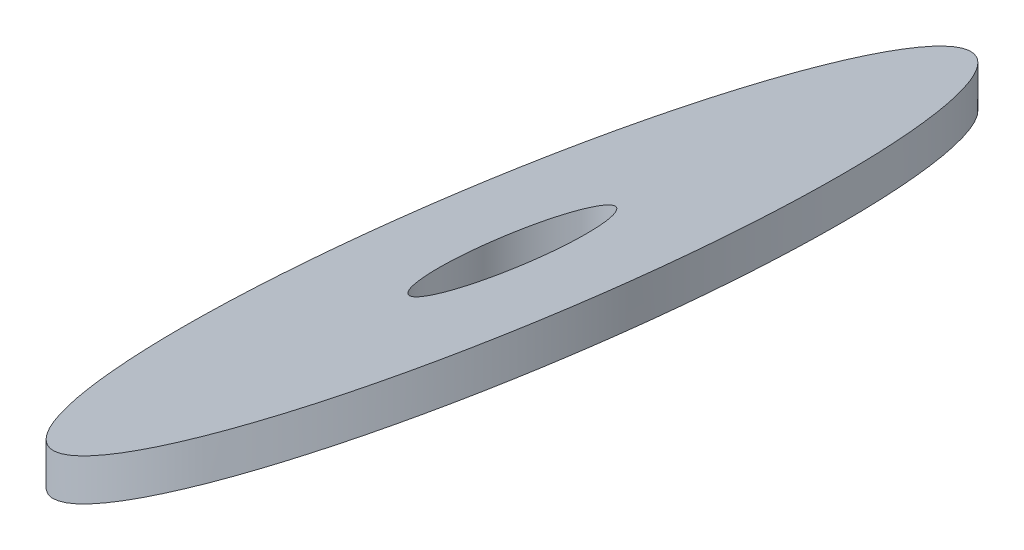
ISO-10303-21;
HEADER;
FILE_DESCRIPTION(('STEP AP214'),'2;1');
FILE_NAME('part.step','',(''),(''),'','','');
FILE_SCHEMA(('AUTOMOTIVE_DESIGN { 1 0 10303 214 1 1 1 1 }'));
ENDSEC;
DATA;
#1=APPLICATION_CONTEXT('core data for automotive mechanical design processes');
#2=APPLICATION_PROTOCOL_DEFINITION('international standard','automotive_design',2000,#1);
#3=PRODUCT_CONTEXT('',#1,'mechanical');
#4=PRODUCT('Part','Part','',(#3));
#5=PRODUCT_RELATED_PRODUCT_CATEGORY('part','',(#4));
#6=PRODUCT_DEFINITION_FORMATION('','',#4);
#7=PRODUCT_DEFINITION_CONTEXT('part definition',#1,'design');
#8=PRODUCT_DEFINITION('design','',#6,#7);
#9=PRODUCT_DEFINITION_SHAPE('','',#8);
#10=(LENGTH_UNIT() NAMED_UNIT(*) SI_UNIT(.MILLI.,.METRE.));
#11=(NAMED_UNIT(*) PLANE_ANGLE_UNIT() SI_UNIT($,.RADIAN.));
#12=(NAMED_UNIT(*) SI_UNIT($,.STERADIAN.) SOLID_ANGLE_UNIT());
#13=UNCERTAINTY_MEASURE_WITH_UNIT(LENGTH_MEASURE(1.E-05),#10,'distance_accuracy_value','');
#14=(GEOMETRIC_REPRESENTATION_CONTEXT(3) GLOBAL_UNCERTAINTY_ASSIGNED_CONTEXT((#13)) GLOBAL_UNIT_ASSIGNED_CONTEXT((#10,
#11,#12)) REPRESENTATION_CONTEXT('',''));
#15=CARTESIAN_POINT('',(0.,0.,0.));
#16=DIRECTION('',(0.,0.,1.));
#17=DIRECTION('',(1.,0.,0.));
#18=AXIS2_PLACEMENT_3D('',#15,#16,#17);
#19=CARTESIAN_POINT('',(24.834212463734,148.471380654833,0.));
#20=DIRECTION('',(0.,-1.,0.));
#21=DIRECTION('',(0.,0.,-1.));
#22=AXIS2_PLACEMENT_3D('',#19,#20,#21);
#23=CYLINDRICAL_SURFACE('',#22,28.966767553693);
#24=CARTESIAN_POINT('',(24.834212463734,70.9959205911231,0.));
#25=DIRECTION('',(-0.573629133636462,0.819115142726273,0.));
#26=DIRECTION('',(-0.819115142726273,-0.573629133636462,0.));
#27=AXIS2_PLACEMENT_3D('',#24,#25,#26);
#28=ELLIPSE('',#27,35.3634868197925,28.966767553693);
#29=CARTESIAN_POINT('',(-4.13255508995896,50.710394284321,0.));
#30=VERTEX_POINT('',#29);
#31=EDGE_CURVE('E103',#30,#30,#28,.F.);
#32=ORIENTED_EDGE('',*,*,#31,.F.);
#33=EDGE_LOOP('',(#32));
#34=FACE_BOUND('',#33,.T.);
#35=CARTESIAN_POINT('',(24.834212463734,74.6582993539369,0.));
#36=DIRECTION('',(0.573629133636462,-0.819115142726273,0.));
#37=DIRECTION('',(-0.819115142726273,-0.573629133636462,0.));
#38=AXIS2_PLACEMENT_3D('',#35,#36,#37);
#39=ELLIPSE('',#38,35.3634868197925,28.966767553693);
#40=CARTESIAN_POINT('',(-4.13255508995895,54.3727730471349,0.));
#41=VERTEX_POINT('',#40);
#42=EDGE_CURVE('E107',#41,#41,#39,.F.);
#43=ORIENTED_EDGE('',*,*,#42,.F.);
#44=EDGE_LOOP('',(#43));
#45=FACE_BOUND('',#44,.T.);
#46=ADVANCED_FACE('F63',(#34,#45),#23,.T.);
#47=CARTESIAN_POINT('',(-26.9078617986992,38.4231479283068,-108.758603935145));
#48=DIRECTION('',(0.573629133636462,-0.819115142726273,0.));
#49=DIRECTION('',(0.819115142726273,0.573629133636462,0.));
#50=AXIS2_PLACEMENT_3D('',#47,#48,#49);
#51=PLANE('',#50);
#52=CARTESIAN_POINT('',(24.8641144943987,74.6792398481964,0.));
#53=DIRECTION('',(0.573629133636462,-0.819115142726273,0.));
#54=DIRECTION('',(-0.819115142726273,-0.573629133636462,0.));
#55=AXIS2_PLACEMENT_3D('',#52,#53,#54);
#56=ELLIPSE('',#55,7.93539230439076,6.5);
#57=CARTESIAN_POINT('',(18.3641144943987,70.1272676355633,0.));
#58=VERTEX_POINT('',#57);
#59=EDGE_CURVE('E110',#58,#58,#56,.F.);
#60=ORIENTED_EDGE('',*,*,#59,.F.);
#61=EDGE_LOOP('',(#60));
#62=FACE_BOUND('',#61,.T.);
#63=ORIENTED_EDGE('',*,*,#42,.T.);
#64=EDGE_LOOP('',(#63));
#65=FACE_BOUND('',#64,.T.);
#66=ADVANCED_FACE('F128',(#62,#65),#51,.F.);
#67=CARTESIAN_POINT('',(24.8641144943987,93.9832591594294,0.));
#68=DIRECTION('',(0.,-1.,0.));
#69=DIRECTION('',(0.,0.,-1.));
#70=AXIS2_PLACEMENT_3D('',#67,#68,#69);
#71=CYLINDRICAL_SURFACE('',#70,6.5);
#72=ORIENTED_EDGE('',*,*,#59,.T.);
#73=EDGE_LOOP('',(#72));
#74=FACE_BOUND('',#73,.T.);
#75=CARTESIAN_POINT('',(24.8641144943987,71.505192919499,0.));
#76=DIRECTION('',(0.573629133636462,-0.819115142726273,0.));
#77=DIRECTION('',(-0.819115142726273,-0.573629133636462,0.));
#78=AXIS2_PLACEMENT_3D('',#75,#76,#77);
#79=ELLIPSE('',#78,7.93539230439076,6.5);
#80=CARTESIAN_POINT('',(18.3641144943987,66.9532207068659,0.));
#81=VERTEX_POINT('',#80);
#82=EDGE_CURVE('E81',#81,#81,#79,.T.);
#83=ORIENTED_EDGE('',*,*,#82,.T.);
#84=EDGE_LOOP('',(#83));
#85=FACE_BOUND('',#84,.T.);
#86=ADVANCED_FACE('F65',(#74,#85),#71,.F.);
#87=CARTESIAN_POINT('',(-25.1870260800424,35.9658762999288,-108.758603935145));
#88=DIRECTION('',(-0.573629133636462,0.819115142726273,0.));
#89=DIRECTION('',(-0.819115142726273,-0.573629133636462,0.));
#90=AXIS2_PLACEMENT_3D('',#87,#88,#89);
#91=PLANE('',#90);
#92=CARTESIAN_POINT('',(34.6474213236797,77.8681442906981,0.));
#93=CARTESIAN_POINT('',(34.6474195356364,77.8681430385252,0.216417099883693));
#94=CARTESIAN_POINT('',(34.6396036920059,77.8626695765215,0.432895981068456));
#95=CARTESIAN_POINT('',(34.6084535535457,77.8408550281076,0.864275765630977));
#96=CARTESIAN_POINT('',(34.5851099832784,77.8245074460767,1.07917564817762));
#97=CARTESIAN_POINT('',(34.5232037443125,77.781154295375,1.50614265602207));
#98=CARTESIAN_POINT('',(34.4846096246183,77.7541267014644,1.71820298499667));
#99=CARTESIAN_POINT('',(34.3927875847711,77.6898234131734,2.13755304907121));
#100=CARTESIAN_POINT('',(34.3395583429507,77.6525467932248,2.34484235147658));
#101=CARTESIAN_POINT('',(34.2195249132046,77.56848697218,2.75231440507734));
#102=CARTESIAN_POINT('',(34.1527885265331,77.5217512525337,2.9525270035119));
#103=CARTESIAN_POINT('',(34.0064515569986,77.4192709726873,3.34580730184386));
#104=CARTESIAN_POINT('',(33.9268505899111,77.3635261434132,3.53887478812748));
#105=CARTESIAN_POINT('',(33.75577483122,77.2437212049799,3.9168550846324));
#106=CARTESIAN_POINT('',(33.6643061985568,77.1796654089475,4.10177205848218));
#107=CARTESIAN_POINT('',(33.4704079773391,77.0438778220149,4.46290108250622));
#108=CARTESIAN_POINT('',(33.3679744937236,76.9721433033901,4.63911000659928));
#109=CARTESIAN_POINT('',(33.1433864544019,76.8148635319621,4.99778923063245));
#110=CARTESIAN_POINT('',(33.0202858356277,76.7286557479593,5.17937718128756));
#111=CARTESIAN_POINT('',(32.7634336232226,76.5487812658637,5.53099591127756));
#112=CARTESIAN_POINT('',(32.6296781896177,76.455111878624,5.70102248261941));
#113=CARTESIAN_POINT('',(32.2141680313284,76.1641286948394,6.19320678018305));
#114=CARTESIAN_POINT('',(31.9181020820982,75.956792698839,6.49757503186352));
#115=CARTESIAN_POINT('',(31.238931847154,75.48116746236,7.10898249221294));
#116=CARTESIAN_POINT('',(30.8498640137125,75.2087019290285,7.40607111315812));
#117=CARTESIAN_POINT('',(30.0417421077059,74.6427713966343,7.93147799701541));
#118=CARTESIAN_POINT('',(29.622668379863,74.3492926329135,8.15975066267161));
#119=CARTESIAN_POINT('',(28.679460173108,73.688760702471,8.58662799792833));
#120=CARTESIAN_POINT('',(28.1508737396167,73.3185898167437,8.77056657902733));
#121=CARTESIAN_POINT('',(27.0772180376636,72.5667050596321,9.04296190342725));
#122=CARTESIAN_POINT('',(26.5321392872789,72.1849845480247,9.13136260408299));
#123=CARTESIAN_POINT('',(25.6712086596295,71.5820718873994,9.19603986491297));
#124=CARTESIAN_POINT('',(25.3567224083763,71.361836090944,9.20405394252993));
#125=CARTESIAN_POINT('',(24.7281215787228,70.9216247818023,9.18901633096266));
#126=CARTESIAN_POINT('',(24.4140070916258,70.701649333056,9.16595815568945));
#127=CARTESIAN_POINT('',(23.7880491087389,70.2632888185365,9.08862595204382));
#128=CARTESIAN_POINT('',(23.4762082552843,70.0449056031997,9.03432011691743));
#129=CARTESIAN_POINT('',(22.8573030490368,69.6114841722623,8.89426765841602));
#130=CARTESIAN_POINT('',(22.5502383746579,69.3964457314541,8.80852316148015));
#131=CARTESIAN_POINT('',(21.9338478486862,68.9647853397074,8.60215285177042));
#132=CARTESIAN_POINT('',(21.624744098168,68.7483189269105,8.48053323313328));
#133=CARTESIAN_POINT('',(21.0168902568043,68.3226368045675,8.2031422110613));
#134=CARTESIAN_POINT('',(20.7181418679203,68.1134222869107,8.047365224206));
#135=CARTESIAN_POINT('',(20.1348815301774,67.7049630791974,7.70164412755453));
#136=CARTESIAN_POINT('',(19.8503432758924,67.505699967361,7.51176638619158));
#137=CARTESIAN_POINT('',(19.2987211707974,67.1193971220892,7.09747138905283));
#138=CARTESIAN_POINT('',(19.0316281658359,66.9323509779702,6.87307245862085));
#139=CARTESIAN_POINT('',(18.6037735950607,66.6327229599369,6.46966817519111));
#140=CARTESIAN_POINT('',(18.4369989473022,66.5159301041878,6.30010509970539));
#141=CARTESIAN_POINT('',(18.1146930183629,66.2902181607265,5.94576875710982));
#142=CARTESIAN_POINT('',(17.9591587166426,66.18129695772,5.76099960498132));
#143=CARTESIAN_POINT('',(17.6609409603188,65.9724540438586,5.37665813987634));
#144=CARTESIAN_POINT('',(17.5182542656375,65.872530063966,5.17708958249092));
#145=CARTESIAN_POINT('',(17.2473886119782,65.6828419210715,4.76372470787601));
#146=CARTESIAN_POINT('',(17.1192102729871,65.5930781922486,4.5499277832439));
#147=CARTESIAN_POINT('',(16.8780484051236,65.4241917120546,4.10702231005065));
#148=CARTESIAN_POINT('',(16.7652160494757,65.3451748278092,3.8777906457877));
#149=CARTESIAN_POINT('',(16.5580058567745,65.2000648217553,3.40716711069992));
#150=CARTESIAN_POINT('',(16.4636283499485,65.1339719312062,3.16577502237608));
#151=CARTESIAN_POINT('',(16.2951725140945,65.0160017336887,2.67288693413868));
#152=CARTESIAN_POINT('',(16.2210752846012,64.96411119066,2.42140059411366));
#153=CARTESIAN_POINT('',(16.094621001762,64.8755548242519,1.9104150973175));
#154=CARTESIAN_POINT('',(16.042259522443,64.8388859013485,1.65091758340673));
#155=CARTESIAN_POINT('',(15.9665243192268,64.7858482797241,1.16557702799892));
#156=CARTESIAN_POINT('',(15.940000118332,64.7672732911956,0.940460365069117));
#157=CARTESIAN_POINT('',(15.9040094694685,64.7420689168046,0.488211160852438));
#158=CARTESIAN_POINT('',(15.8945410980366,64.7354381839344,0.261078849782937));
#159=CARTESIAN_POINT('',(15.8928296697495,64.7342396648563,-0.193191353166451));
#160=CARTESIAN_POINT('',(15.9005800307559,64.7396672691546,-0.420329209734519));
#161=CARTESIAN_POINT('',(15.9331543036704,64.7624791437937,-0.872767475316105));
#162=CARTESIAN_POINT('',(15.9579777573344,64.7798630932245,-1.09806793348144));
#163=CARTESIAN_POINT('',(16.0215034825952,64.8243503757129,-1.52638786930362));
#164=CARTESIAN_POINT('',(16.0588807890977,64.8505258311871,-1.72970287887979));
#165=CARTESIAN_POINT('',(16.1471094118867,64.9123126372324,-2.13199441534885));
#166=CARTESIAN_POINT('',(16.197965201125,64.9479271202269,-2.33096947822442));
#167=CARTESIAN_POINT('',(16.3124637554463,65.0281108490972,-2.72330138102948));
#168=CARTESIAN_POINT('',(16.3761040538722,65.0726783675647,-2.91665929651276));
#169=CARTESIAN_POINT('',(16.5154056088404,65.170231722548,-3.29681505929502));
#170=CARTESIAN_POINT('',(16.5910681542895,65.2232184616898,-3.48361220058758));
#171=CARTESIAN_POINT('',(16.7582632335535,65.3403057470588,-3.86037125936873));
#172=CARTESIAN_POINT('',(16.8504593543281,65.4048710055016,-4.04989442024594));
#173=CARTESIAN_POINT('',(17.0463040508757,65.5420217157595,-4.41985617467965));
#174=CARTESIAN_POINT('',(17.1499532260844,65.6146075873614,-4.60029429201847));
#175=CARTESIAN_POINT('',(17.4765962268683,65.8433567970567,-5.12714341818351));
#176=CARTESIAN_POINT('',(17.7153359582097,66.0105470467671,-5.45920097041931));
#177=CARTESIAN_POINT('',(18.2660534440492,66.3962163840829,-6.12951687529985));
#178=CARTESIAN_POINT('',(18.5836478394626,66.6186288245152,-6.46083712450543));
#179=CARTESIAN_POINT('',(19.2533902139697,67.087651698112,-7.06642912404254));
#180=CARTESIAN_POINT('',(19.6055594371364,67.3342770085734,-7.34066547293175));
#181=CARTESIAN_POINT('',(20.4076021865577,67.8959502868365,-7.88041617628144));
#182=CARTESIAN_POINT('',(20.8630555665,68.2149058452437,-8.13356787041656));
#183=CARTESIAN_POINT('',(21.7985218874793,68.8700161066209,-8.55919458788437));
#184=CARTESIAN_POINT('',(22.2785494881374,69.2061810757736,-8.73162081780263));
#185=CARTESIAN_POINT('',(23.3416126550423,69.9506478443928,-9.02123134428155));
#186=CARTESIAN_POINT('',(23.9275300516316,70.3609677994964,-9.12270759018395));
#187=CARTESIAN_POINT('',(25.1058171258121,71.1861262641386,-9.21614644703169));
#188=CARTESIAN_POINT('',(25.6981923079476,71.6009686285285,-9.20800690393516));
#189=CARTESIAN_POINT('',(26.6097889571614,72.2393628771978,-9.11037411292779));
#190=CARTESIAN_POINT('',(26.9320418906431,72.465037707759,-9.05911499003725));
#191=CARTESIAN_POINT('',(27.5719161126264,72.9131438120742,-8.92313764649814));
#192=CARTESIAN_POINT('',(27.8895366989386,73.1355745940824,-8.83841440677993));
#193=CARTESIAN_POINT('',(28.5172652578203,73.5751750490218,-8.63525780052491));
#194=CARTESIAN_POINT('',(28.8273774870416,73.7923477029007,-8.51684404362483));
#195=CARTESIAN_POINT('',(29.4374218345083,74.2195638441534,-8.24591185688428));
#196=CARTESIAN_POINT('',(29.7373567947827,74.4296093218097,-8.09340303997161));
#197=CARTESIAN_POINT('',(30.2564840005464,74.793155878034,-7.79291934065483));
#198=CARTESIAN_POINT('',(30.4784059815527,74.948568599713,-7.65194012570629));
#199=CARTESIAN_POINT('',(30.9126533827472,75.2526735387353,-7.34940319901141));
#200=CARTESIAN_POINT('',(31.1249795562854,75.4013662836524,-7.18784710653568));
#201=CARTESIAN_POINT('',(31.5379062699518,75.6905402723391,-6.84435013714735));
#202=CARTESIAN_POINT('',(31.7385209673764,75.8310314305118,-6.66243468182391));
#203=CARTESIAN_POINT('',(32.1262035675951,76.1025268802836,-6.27821191941811));
#204=CARTESIAN_POINT('',(32.3132737573492,76.2335327734486,-6.07590806873387));
#205=CARTESIAN_POINT('',(32.6390699890677,76.4616889878737,-5.68981917172769));
#206=CARTESIAN_POINT('',(32.7804138591679,76.5606725831233,-5.50932077500129));
#207=CARTESIAN_POINT('',(33.0510742083431,76.7502169505859,-5.13535775319636));
#208=CARTESIAN_POINT('',(33.1803926835207,76.8407791206764,-4.94189528923717));
#209=CARTESIAN_POINT('',(33.4256187723792,77.0125117887221,-4.5425092385892));
#210=CARTESIAN_POINT('',(33.5415196027098,77.0936775362738,-4.3365794284028));
#211=CARTESIAN_POINT('',(33.7583243106162,77.2455066141135,-3.91324532437582));
#212=CARTESIAN_POINT('',(33.8592285596276,77.3161702045191,-3.69584131490926));
#213=CARTESIAN_POINT('',(34.0453768304935,77.4465304747362,-3.24876691207908));
#214=CARTESIAN_POINT('',(34.1304721658411,77.5061230288788,-3.01900393608659));
#215=CARTESIAN_POINT('',(34.282410656881,77.6125260733777,-2.55066337326307));
#216=CARTESIAN_POINT('',(34.3492568525362,77.6593386926304,-2.31208726206089));
#217=CARTESIAN_POINT('',(34.4632907273433,77.739197004849,-1.82877377036877));
#218=CARTESIAN_POINT('',(34.510534824785,77.7722822077361,-1.58405625254057));
#219=CARTESIAN_POINT('',(34.5846545634843,77.8241885140386,-1.09020423125694));
#220=CARTESIAN_POINT('',(34.6115473848038,77.8430216487103,-0.841073635472119));
#221=CARTESIAN_POINT('',(34.6344689147368,77.8590736744528,-0.492721690111019));
#222=CARTESIAN_POINT('',(34.6393237595048,77.8624735388344,-0.39427568246718));
#223=CARTESIAN_POINT('',(34.6458003600949,77.8670091243603,-0.197224058777815));
#224=CARTESIAN_POINT('',(34.6474221384676,77.8681448612969,-0.0986184438503524));
#225=CARTESIAN_POINT('',(34.6474213236797,77.8681442906981,0.));
#226=B_SPLINE_CURVE_WITH_KNOTS('',3,(#92,#93,#94,#95,#96,#97,#98,#99,#100,#101,#102,#103,#104,
#105,#106,#107,#108,#109,#110,#111,#112,#113,#114,#115,#116,#117,#118,#119,#120,#121,#122,#123,
#124,#125,#126,#127,#128,#129,#130,#131,#132,#133,#134,#135,#136,#137,#138,#139,#140,#141,#142,
#143,#144,#145,#146,#147,#148,#149,#150,#151,#152,#153,#154,#155,#156,#157,#158,#159,#160,#161,
#162,#163,#164,#165,#166,#167,#168,#169,#170,#171,#172,#173,#174,#175,#176,#177,#178,#179,#180,
#181,#182,#183,#184,#185,#186,#187,#188,#189,#190,#191,#192,#193,#194,#195,#196,#197,#198,#199,
#200,#201,#202,#203,#204,#205,#206,#207,#208,#209,#210,#211,#212,#213,#214,#215,#216,#217,#218,
#219,#220,#221,#222,#223,#224,#225),.UNSPECIFIED.,.T.,.F.,(4,2,2,2,2,2,2,2,2,2,2,2,2,2,2,2,2,2,
2,2,2,2,2,2,2,2,2,2,2,2,2,2,2,2,2,2,2,2,2,2,2,2,2,2,2,2,2,2,2,2,2,2,2,2,2,2,2,2,2,2,2,2,2,2,2,2,
4),(0.,0.649149665104474,1.29868744631799,1.94957181039043,2.60051497378839,3.24826823935465,
3.8960408548515,4.54347863169288,5.19114716693918,5.89757624716896,6.60426108500584,
8.01723216030015,9.69195877112047,11.3677926243042,13.3732394452679,15.3798620264922,
16.5308317554351,17.6820417774976,18.8344256856183,19.9867316635017,21.1745598896002,
22.3625824250229,23.548317351739,24.733424997199,25.5276189287203,26.321598642316,
27.1153775555563,27.9091903766256,28.7103303270254,29.5114846115512,30.3118896877755,
31.11213170033,31.793508958918,32.4748093706957,33.1558493892116,33.8368711292305,
34.4612918593458,35.0859200689502,35.7104278776629,36.3350026851783,36.995597194972,
37.6562262956807,38.9771054514264,40.5016466245678,42.0271304664483,43.8531553824835,
45.6802825941375,47.8390571462391,49.9998436602714,51.1888439823529,52.3780227027733,
53.5665106702647,54.7546639713053,55.670072070722,56.5854081777461,57.4996138459558,
58.4136647908396,59.1620909455326,59.9103926459332,60.6590710166452,61.4077308409829,
62.1631102329552,62.9183637160645,63.6714281096973,64.4238560729804,64.7196671542868,
65.0154761723033),.UNSPECIFIED.);
#227=CARTESIAN_POINT('',(34.6474213236797,77.8681442906981,0.));
#228=VERTEX_POINT('',#227);
#229=EDGE_CURVE('E67',#228,#228,#226,.T.);
#230=ORIENTED_EDGE('',*,*,#229,.F.);
#231=EDGE_LOOP('',(#230));
#232=FACE_BOUND('',#231,.T.);
#233=ORIENTED_EDGE('',*,*,#31,.T.);
#234=EDGE_LOOP('',(#233));
#235=FACE_BOUND('',#234,.T.);
#236=ADVANCED_FACE('F95',(#232,#235),#91,.F.);
#237=CARTESIAN_POINT('',(25.0410697039325,71.6291152574495,0.));
#238=DIRECTION('',(0.573629133636462,-0.819115142726273,0.));
#239=DIRECTION('',(0.819115142726273,0.573629133636462,0.));
#240=AXIS2_PLACEMENT_3D('',#237,#238,#239);
#241=PLANE('',#240);
#242=ORIENTED_EDGE('',*,*,#82,.F.);
#243=EDGE_LOOP('',(#242));
#244=FACE_BOUND('',#243,.T.);
#245=CARTESIAN_POINT('',(34.4179696702251,78.1957903477886,0.));
#246=CARTESIAN_POINT('',(34.4179678821818,78.1957890956158,0.216417099883693));
#247=CARTESIAN_POINT('',(34.4101520385513,78.190315633612,0.432895981068454));
#248=CARTESIAN_POINT('',(34.3790019000911,78.1685010851981,0.864275765630977));
#249=CARTESIAN_POINT('',(34.3556583298238,78.1521535031673,1.07917564817762));
#250=CARTESIAN_POINT('',(34.2937520908579,78.1088003524655,1.50614265602207));
#251=CARTESIAN_POINT('',(34.2551579711637,78.0817727585549,1.71820298499667));
#252=CARTESIAN_POINT('',(34.1633359313165,78.0174694702639,2.1375530490712));
#253=CARTESIAN_POINT('',(34.1101066894961,77.9801928503153,2.34484235147658));
#254=CARTESIAN_POINT('',(33.99007325975,77.8961330292705,2.75231440507734));
#255=CARTESIAN_POINT('',(33.9233368730785,77.8493973096243,2.9525270035119));
#256=CARTESIAN_POINT('',(33.776999903544,77.7469170297778,3.34580730184386));
#257=CARTESIAN_POINT('',(33.6973989364565,77.6911722005038,3.53887478812749));
#258=CARTESIAN_POINT('',(33.5263231777654,77.5713672620705,3.9168550846324));
#259=CARTESIAN_POINT('',(33.4348545451022,77.507311466038,4.10177205848218));
#260=CARTESIAN_POINT('',(33.2409563238845,77.3715238791054,4.46290108250622));
#261=CARTESIAN_POINT('',(33.138522840269,77.2997893604806,4.63911000659928));
#262=CARTESIAN_POINT('',(32.9139348009473,77.1425095890526,4.99778923063245));
#263=CARTESIAN_POINT('',(32.7908341821731,77.0563018050499,5.17937718128755));
#264=CARTESIAN_POINT('',(32.533981969768,76.8764273229543,5.53099591127755));
#265=CARTESIAN_POINT('',(32.4002265361631,76.7827579357146,5.70102248261941));
#266=CARTESIAN_POINT('',(31.9847163778738,76.49177475193,6.19320678018305));
#267=CARTESIAN_POINT('',(31.6886504286436,76.2844387559296,6.49757503186352));
#268=CARTESIAN_POINT('',(31.0094801936994,75.8088135194506,7.10898249221294));
#269=CARTESIAN_POINT('',(30.6204123602579,75.536347986119,7.40607111315813));
#270=CARTESIAN_POINT('',(29.8122904542513,74.9704174537248,7.93147799701541));
#271=CARTESIAN_POINT('',(29.3932167264084,74.676938690004,8.1597506626716));
#272=CARTESIAN_POINT('',(28.4500085196534,74.0164067595615,8.58662799792833));
#273=CARTESIAN_POINT('',(27.9214220861621,73.6462358738342,8.77056657902733));
#274=CARTESIAN_POINT('',(26.847766384209,72.8943511167226,9.04296190342726));
#275=CARTESIAN_POINT('',(26.3026876338243,72.5126306051152,9.13136260408299));
#276=CARTESIAN_POINT('',(25.4417570061749,71.9097179444899,9.19603986491297));
#277=CARTESIAN_POINT('',(25.1272707549217,71.6894821480345,9.20405394252993));
#278=CARTESIAN_POINT('',(24.4986699252682,71.2492708388929,9.18901633096266));
#279=CARTESIAN_POINT('',(24.1845554381712,71.0292953901465,9.16595815568946));
#280=CARTESIAN_POINT('',(23.5585974552843,70.590934875627,9.08862595204382));
#281=CARTESIAN_POINT('',(23.2467566018297,70.3725516602902,9.03432011691743));
#282=CARTESIAN_POINT('',(22.6278513955821,69.9391302293529,8.89426765841601));
#283=CARTESIAN_POINT('',(22.3207867212033,69.7240917885446,8.80852316148015));
#284=CARTESIAN_POINT('',(21.7043961952316,69.2924313967979,8.60215285177042));
#285=CARTESIAN_POINT('',(21.3952924447134,69.075964984001,8.48053323313328));
#286=CARTESIAN_POINT('',(20.7874386033497,68.650282861658,8.2031422110613));
#287=CARTESIAN_POINT('',(20.4886902144657,68.4410683440013,8.047365224206));
#288=CARTESIAN_POINT('',(19.9054298767228,68.0326091362879,7.70164412755453));
#289=CARTESIAN_POINT('',(19.6208916224378,67.8333460244516,7.51176638619158));
#290=CARTESIAN_POINT('',(19.0692695173428,67.4470431791797,7.09747138905283));
#291=CARTESIAN_POINT('',(18.8021765123813,67.2599970350607,6.87307245862085));
#292=CARTESIAN_POINT('',(18.3743219416061,66.9603690170274,6.4696681751911));
#293=CARTESIAN_POINT('',(18.2075472938475,66.8435761612784,6.30010509970537));
#294=CARTESIAN_POINT('',(17.8852413649083,66.6178642178171,5.9457687571098));
#295=CARTESIAN_POINT('',(17.7297070631879,66.5089430148106,5.76099960498132));
#296=CARTESIAN_POINT('',(17.4314893068642,66.3001001009491,5.37665813987634));
#297=CARTESIAN_POINT('',(17.2888026121828,66.2001761210565,5.17708958249091));
#298=CARTESIAN_POINT('',(17.0179369585236,66.0104879781621,4.76372470787599));
#299=CARTESIAN_POINT('',(16.8897586195325,65.9207242493392,4.54992778324389));
#300=CARTESIAN_POINT('',(16.648596751669,65.7518377691451,4.10702231005065));
#301=CARTESIAN_POINT('',(16.5357643960211,65.6728208848997,3.87779064578769));
#302=CARTESIAN_POINT('',(16.3285542033199,65.5277108788459,3.40716711069991));
#303=CARTESIAN_POINT('',(16.2341766964939,65.4616179882967,3.16577502237607));
#304=CARTESIAN_POINT('',(16.0657208606399,65.3436477907793,2.67288693413868));
#305=CARTESIAN_POINT('',(15.9916236311466,65.2917572477505,2.42140059411365));
#306=CARTESIAN_POINT('',(15.8651693483074,65.2032008813425,1.91041509731749));
#307=CARTESIAN_POINT('',(15.8128078689884,65.166531958439,1.65091758340672));
#308=CARTESIAN_POINT('',(15.7370726657721,65.1134943368146,1.16557702799891));
#309=CARTESIAN_POINT('',(15.7105484648774,65.0949193482862,0.940460365069109));
#310=CARTESIAN_POINT('',(15.6745578160139,65.0697149738952,0.48821116085243));
#311=CARTESIAN_POINT('',(15.665089444582,65.0630842410249,0.261078849782929));
#312=CARTESIAN_POINT('',(15.6633780162948,65.0618857219469,-0.193191353166459));
#313=CARTESIAN_POINT('',(15.6711283773012,65.0673133262452,-0.420329209734527));
#314=CARTESIAN_POINT('',(15.7037026502158,65.0901252008843,-0.872767475316113));
#315=CARTESIAN_POINT('',(15.7285261038798,65.107509150315,-1.09806793348144));
#316=CARTESIAN_POINT('',(15.7920518291406,65.1519964328034,-1.52638786930362));
#317=CARTESIAN_POINT('',(15.8294291356431,65.1781718882776,-1.72970287887979));
#318=CARTESIAN_POINT('',(15.9176577584321,65.2399586943229,-2.13199441534885));
#319=CARTESIAN_POINT('',(15.9685135476704,65.2755731773175,-2.33096947822443));
#320=CARTESIAN_POINT('',(16.0830121019917,65.3557569061878,-2.72330138102949));
#321=CARTESIAN_POINT('',(16.1466524004176,65.4003244246552,-2.91665929651276));
#322=CARTESIAN_POINT('',(16.2859539553858,65.4978777796386,-3.29681505929502));
#323=CARTESIAN_POINT('',(16.3616165008349,65.5508645187803,-3.48361220058758));
#324=CARTESIAN_POINT('',(16.5288115800988,65.6679518041493,-3.86037125936873));
#325=CARTESIAN_POINT('',(16.6210077008735,65.7325170625922,-4.04989442024595));
#326=CARTESIAN_POINT('',(16.8168523974211,65.8696677728501,-4.41985617467965));
#327=CARTESIAN_POINT('',(16.9205015726298,65.9422536444519,-4.60029429201848));
#328=CARTESIAN_POINT('',(17.2471445734137,66.1710028541473,-5.12714341818352));
#329=CARTESIAN_POINT('',(17.4858843047551,66.3381931038577,-5.45920097041932));
#330=CARTESIAN_POINT('',(18.0366017905946,66.7238624411735,-6.12951687529985));
#331=CARTESIAN_POINT('',(18.354196186008,66.9462748816057,-6.46083712450543));
#332=CARTESIAN_POINT('',(19.0239385605151,67.4152977552026,-7.06642912404255));
#333=CARTESIAN_POINT('',(19.3761077836818,67.661923065664,-7.34066547293176));
#334=CARTESIAN_POINT('',(20.1781505331031,68.223596343927,-7.88041617628144));
#335=CARTESIAN_POINT('',(20.6336039130454,68.5425519023343,-8.13356787041656));
#336=CARTESIAN_POINT('',(21.5690702340247,69.1976621637115,-8.55919458788437));
#337=CARTESIAN_POINT('',(22.0490978346827,69.5338271328642,-8.73162081780263));
#338=CARTESIAN_POINT('',(23.1121610015876,70.2782939014834,-9.02123134428155));
#339=CARTESIAN_POINT('',(23.698078398177,70.6886138565869,-9.12270759018396));
#340=CARTESIAN_POINT('',(24.8763654723575,71.5137723212291,-9.21614644703169));
#341=CARTESIAN_POINT('',(25.468740654493,71.9286146856191,-9.20800690393516));
#342=CARTESIAN_POINT('',(26.3803373037068,72.5670089342884,-9.11037411292779));
#343=CARTESIAN_POINT('',(26.7025902371885,72.7926837648496,-9.05911499003725));
#344=CARTESIAN_POINT('',(27.3424644591718,73.2407898691647,-8.92313764649814));
#345=CARTESIAN_POINT('',(27.660085045484,73.4632206511729,-8.83841440677993));
#346=CARTESIAN_POINT('',(28.2878136043657,73.9028211061123,-8.6352578005249));
#347=CARTESIAN_POINT('',(28.597925833587,74.1199937599912,-8.51684404362482));
#348=CARTESIAN_POINT('',(29.2079701810537,74.5472099012439,-8.24591185688428));
#349=CARTESIAN_POINT('',(29.507905141328,74.7572553789002,-8.0934030399716));
#350=CARTESIAN_POINT('',(30.0270323470918,75.1208019351245,-7.79291934065482));
#351=CARTESIAN_POINT('',(30.2489543280981,75.2762146568035,-7.65194012570628));
#352=CARTESIAN_POINT('',(30.6832017292926,75.5803195958259,-7.3494031990114));
#353=CARTESIAN_POINT('',(30.8955279028308,75.7290123407429,-7.18784710653567));
#354=CARTESIAN_POINT('',(31.3084546164972,76.0181863294296,-6.84435013714733));
#355=CARTESIAN_POINT('',(31.5090693139218,76.1586774876023,-6.6624346818239));
#356=CARTESIAN_POINT('',(31.8967519141405,76.4301729373741,-6.2782119194181));
#357=CARTESIAN_POINT('',(32.0838221038946,76.5611788305392,-6.07590806873386));
#358=CARTESIAN_POINT('',(32.4096183356131,76.7893350449643,-5.68981917172767));
#359=CARTESIAN_POINT('',(32.5509622057133,76.8883186402138,-5.50932077500127));
#360=CARTESIAN_POINT('',(32.8216225548885,77.0778630076765,-5.13535775319634));
#361=CARTESIAN_POINT('',(32.9509410300661,77.168425177767,-4.94189528923716));
#362=CARTESIAN_POINT('',(33.1961671189246,77.3401578458126,-4.54250923858918));
#363=CARTESIAN_POINT('',(33.3120679492552,77.4213235933643,-4.33657942840278));
#364=CARTESIAN_POINT('',(33.5288726571616,77.573152671204,-3.9132453243758));
#365=CARTESIAN_POINT('',(33.629776906173,77.6438162616096,-3.69584131490924));
#366=CARTESIAN_POINT('',(33.8159251770389,77.7741765318268,-3.24876691207906));
#367=CARTESIAN_POINT('',(33.9010205123865,77.8337690859694,-3.01900393608657));
#368=CARTESIAN_POINT('',(34.0529590034264,77.9401721304683,-2.55066337326305));
#369=CARTESIAN_POINT('',(34.1198051990816,77.986984749721,-2.31208726206087));
#370=CARTESIAN_POINT('',(34.2338390738887,78.0668430619396,-1.82877377036874));
#371=CARTESIAN_POINT('',(34.2810831713304,78.0999282648266,-1.58405625254055));
#372=CARTESIAN_POINT('',(34.3552029100297,78.1518345711292,-1.09020423125692));
#373=CARTESIAN_POINT('',(34.3820957313492,78.1706677058008,-0.841073635472092));
#374=CARTESIAN_POINT('',(34.4050172612822,78.1867197315433,-0.492721690110995));
#375=CARTESIAN_POINT('',(34.4098721060502,78.1901195959249,-0.394275682467161));
#376=CARTESIAN_POINT('',(34.4163487066403,78.1946551814508,-0.197224058777806));
#377=CARTESIAN_POINT('',(34.417970485013,78.1957909183874,-0.0986184438503476));
#378=CARTESIAN_POINT('',(34.4179696702251,78.1957903477886,0.));
#379=B_SPLINE_CURVE_WITH_KNOTS('',3,(#245,#246,#247,#248,#249,#250,#251,#252,#253,#254,#255,
#256,#257,#258,#259,#260,#261,#262,#263,#264,#265,#266,#267,#268,#269,#270,#271,#272,#273,#274,
#275,#276,#277,#278,#279,#280,#281,#282,#283,#284,#285,#286,#287,#288,#289,#290,#291,#292,#293,
#294,#295,#296,#297,#298,#299,#300,#301,#302,#303,#304,#305,#306,#307,#308,#309,#310,#311,#312,
#313,#314,#315,#316,#317,#318,#319,#320,#321,#322,#323,#324,#325,#326,#327,#328,#329,#330,#331,
#332,#333,#334,#335,#336,#337,#338,#339,#340,#341,#342,#343,#344,#345,#346,#347,#348,#349,#350,
#351,#352,#353,#354,#355,#356,#357,#358,#359,#360,#361,#362,#363,#364,#365,#366,#367,#368,#369,
#370,#371,#372,#373,#374,#375,#376,#377,#378),.UNSPECIFIED.,.T.,.F.,(4,2,2,2,2,2,2,2,2,2,2,2,2,
2,2,2,2,2,2,2,2,2,2,2,2,2,2,2,2,2,2,2,2,2,2,2,2,2,2,2,2,2,2,2,2,2,2,2,2,2,2,2,2,2,2,2,2,2,2,2,2,
2,2,2,2,2,4),(0.,0.649149665104473,1.29868744631799,1.94957181039043,2.60051497378839,
3.24826823935465,3.89604085485151,4.54347863169288,5.19114716693918,5.89757624716895,
6.60426108500583,8.01723216030015,9.69195877112047,11.3677926243042,13.3732394452679,
15.3798620264922,16.5308317554351,17.6820417774976,18.8344256856183,19.9867316635017,
21.1745598896002,22.3625824250229,23.548317351739,24.733424997199,25.5276189287203,
26.321598642316,27.1153775555563,27.9091903766256,28.7103303270254,29.5114846115512,
30.3118896877755,31.11213170033,31.793508958918,32.4748093706957,33.1558493892116,
33.8368711292305,34.4612918593458,35.0859200689502,35.7104278776629,36.3350026851784,
36.995597194972,37.6562262956807,38.9771054514264,40.5016466245678,42.0271304664483,
43.8531553824835,45.6802825941375,47.8390571462391,49.9998436602714,51.1888439823529,
52.3780227027733,53.5665106702647,54.7546639713053,55.670072070722,56.5854081777461,
57.4996138459558,58.4136647908396,59.1620909455326,59.9103926459332,60.6590710166452,
61.4077308409829,62.1631102329552,62.9183637160645,63.6714281096973,64.4238560729804,
64.7196671542868,65.0154761723033),.UNSPECIFIED.);
#380=CARTESIAN_POINT('',(34.4179696702251,78.1957903477886,0.));
#381=VERTEX_POINT('',#380);
#382=EDGE_CURVE('E12',#381,#381,#379,.T.);
#383=ORIENTED_EDGE('',*,*,#382,.T.);
#384=EDGE_LOOP('',(#383));
#385=FACE_BOUND('',#384,.T.);
#386=ADVANCED_FACE('F88',(#244,#385),#241,.T.);
#387=CARTESIAN_POINT('',(24.7542551371142,72.0386728288126,0.));
#388=DIRECTION('',(0.573629133636462,-0.819115142726273,0.));
#389=DIRECTION('',(-0.819115142726273,-0.573629133636462,0.));
#390=AXIS2_PLACEMENT_3D('',#387,#388,#389);
#391=ELLIPSE('',#390,11.9475968971631,9.6992627391311);
#392=DIRECTION('',(0.573629133636462,-0.819115142726273,0.));
#393=VECTOR('',#392,1.);
#394=SURFACE_OF_LINEAR_EXTRUSION('',#391,#393);
#395=OFFSET_SURFACE('',#394,-0.5,.F.);
#396=ORIENTED_EDGE('',*,*,#382,.F.);
#397=EDGE_LOOP('',(#396));
#398=FACE_BOUND('',#397,.T.);
#399=ORIENTED_EDGE('',*,*,#229,.T.);
#400=EDGE_LOOP('',(#399));
#401=FACE_BOUND('',#400,.T.);
#402=ADVANCED_FACE('F91',(#398,#401),#395,.F.);
#403=CLOSED_SHELL('',(#46,#66,#86,#236,#386,#402));
#404=MANIFOLD_SOLID_BREP('B2',#403);
#405=ADVANCED_BREP_SHAPE_REPRESENTATION('',(#18,#404),#14);
#406=SHAPE_DEFINITION_REPRESENTATION(#9,#405);
ENDSEC;
END-ISO-10303-21;
